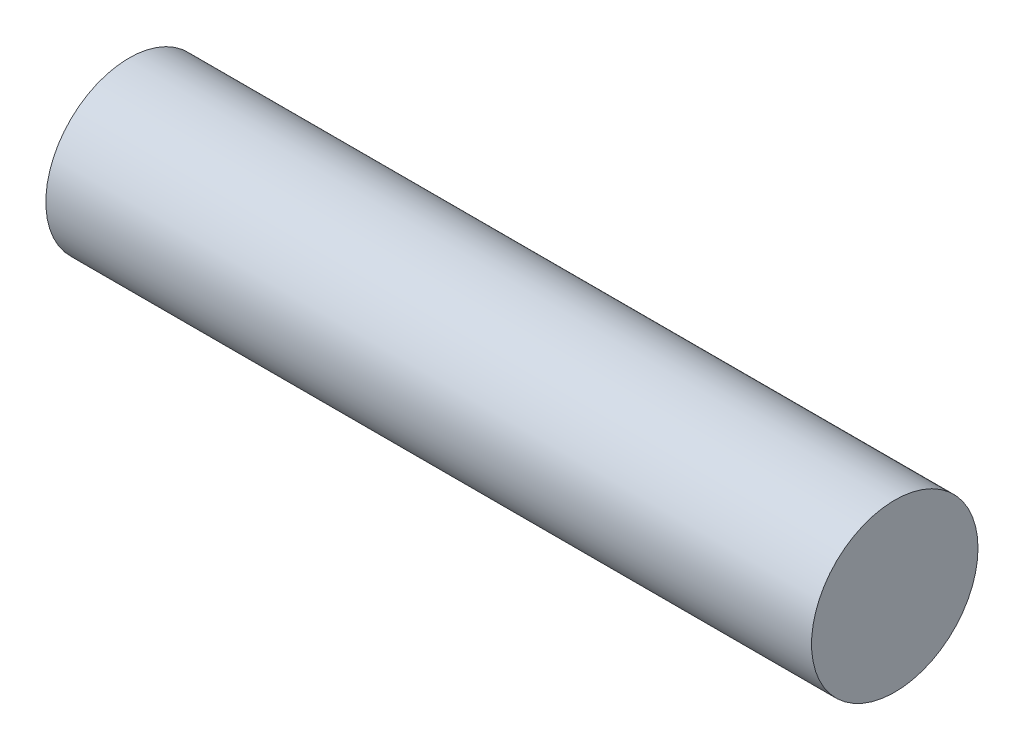
ISO-10303-21;
HEADER;
FILE_DESCRIPTION(('STEP AP214'),'2;1');
FILE_NAME('part.step','',(''),(''),'','','');
FILE_SCHEMA(('AUTOMOTIVE_DESIGN { 1 0 10303 214 1 1 1 1 }'));
ENDSEC;
DATA;
#1=APPLICATION_CONTEXT('core data for automotive mechanical design processes');
#2=APPLICATION_PROTOCOL_DEFINITION('international standard','automotive_design',2000,#1);
#3=PRODUCT_CONTEXT('',#1,'mechanical');
#4=PRODUCT('Part','Part','',(#3));
#5=PRODUCT_RELATED_PRODUCT_CATEGORY('part','',(#4));
#6=PRODUCT_DEFINITION_FORMATION('','',#4);
#7=PRODUCT_DEFINITION_CONTEXT('part definition',#1,'design');
#8=PRODUCT_DEFINITION('design','',#6,#7);
#9=PRODUCT_DEFINITION_SHAPE('','',#8);
#10=(LENGTH_UNIT() NAMED_UNIT(*) SI_UNIT(.MILLI.,.METRE.));
#11=(NAMED_UNIT(*) PLANE_ANGLE_UNIT() SI_UNIT($,.RADIAN.));
#12=(NAMED_UNIT(*) SI_UNIT($,.STERADIAN.) SOLID_ANGLE_UNIT());
#13=UNCERTAINTY_MEASURE_WITH_UNIT(LENGTH_MEASURE(1.E-05),#10,'distance_accuracy_value','');
#14=(GEOMETRIC_REPRESENTATION_CONTEXT(3) GLOBAL_UNCERTAINTY_ASSIGNED_CONTEXT((#13)) GLOBAL_UNIT_ASSIGNED_CONTEXT((#10,
#11,#12)) REPRESENTATION_CONTEXT('',''));
#15=CARTESIAN_POINT('',(0.,0.,0.));
#16=DIRECTION('',(0.,0.,1.));
#17=DIRECTION('',(1.,0.,0.));
#18=AXIS2_PLACEMENT_3D('',#15,#16,#17);
#19=CARTESIAN_POINT('',(46.,0.,0.));
#20=DIRECTION('',(-1.,0.,0.));
#21=DIRECTION('',(0.,0.,1.));
#22=AXIS2_PLACEMENT_3D('',#19,#20,#21);
#23=CYLINDRICAL_SURFACE('',#22,5.);
#24=CARTESIAN_POINT('',(46.,0.,0.));
#25=DIRECTION('',(1.,0.,0.));
#26=DIRECTION('',(0.,0.,-1.));
#27=AXIS2_PLACEMENT_3D('',#24,#25,#26);
#28=CIRCLE('',#27,5.);
#29=CARTESIAN_POINT('',(46.,0.,-5.));
#30=VERTEX_POINT('',#29);
#31=EDGE_CURVE('E12',#30,#30,#28,.T.);
#32=ORIENTED_EDGE('',*,*,#31,.F.);
#33=EDGE_LOOP('',(#32));
#34=FACE_BOUND('',#33,.T.);
#35=CARTESIAN_POINT('',(0.,0.,0.));
#36=DIRECTION('',(1.,0.,0.));
#37=DIRECTION('',(0.,0.,-1.));
#38=AXIS2_PLACEMENT_3D('',#35,#36,#37);
#39=CIRCLE('',#38,5.);
#40=CARTESIAN_POINT('',(0.,0.,-5.));
#41=VERTEX_POINT('',#40);
#42=EDGE_CURVE('E43',#41,#41,#39,.T.);
#43=ORIENTED_EDGE('',*,*,#42,.T.);
#44=EDGE_LOOP('',(#43));
#45=FACE_BOUND('',#44,.T.);
#46=ADVANCED_FACE('F40',(#34,#45),#23,.T.);
#47=CARTESIAN_POINT('',(46.,0.,0.));
#48=DIRECTION('',(1.,0.,0.));
#49=DIRECTION('',(0.,0.,-1.));
#50=AXIS2_PLACEMENT_3D('',#47,#48,#49);
#51=PLANE('',#50);
#52=ORIENTED_EDGE('',*,*,#31,.T.);
#53=EDGE_LOOP('',(#52));
#54=FACE_BOUND('',#53,.T.);
#55=ADVANCED_FACE('F55',(#54),#51,.T.);
#56=CARTESIAN_POINT('',(0.,0.,0.));
#57=DIRECTION('',(1.,0.,0.));
#58=DIRECTION('',(0.,0.,-1.));
#59=AXIS2_PLACEMENT_3D('',#56,#57,#58);
#60=PLANE('',#59);
#61=ORIENTED_EDGE('',*,*,#42,.F.);
#62=EDGE_LOOP('',(#61));
#63=FACE_BOUND('',#62,.T.);
#64=ADVANCED_FACE('F53',(#63),#60,.F.);
#65=CLOSED_SHELL('',(#46,#55,#64));
#66=MANIFOLD_SOLID_BREP('B2',#65);
#67=ADVANCED_BREP_SHAPE_REPRESENTATION('',(#18,#66),#14);
#68=SHAPE_DEFINITION_REPRESENTATION(#9,#67);
ENDSEC;
END-ISO-10303-21;
